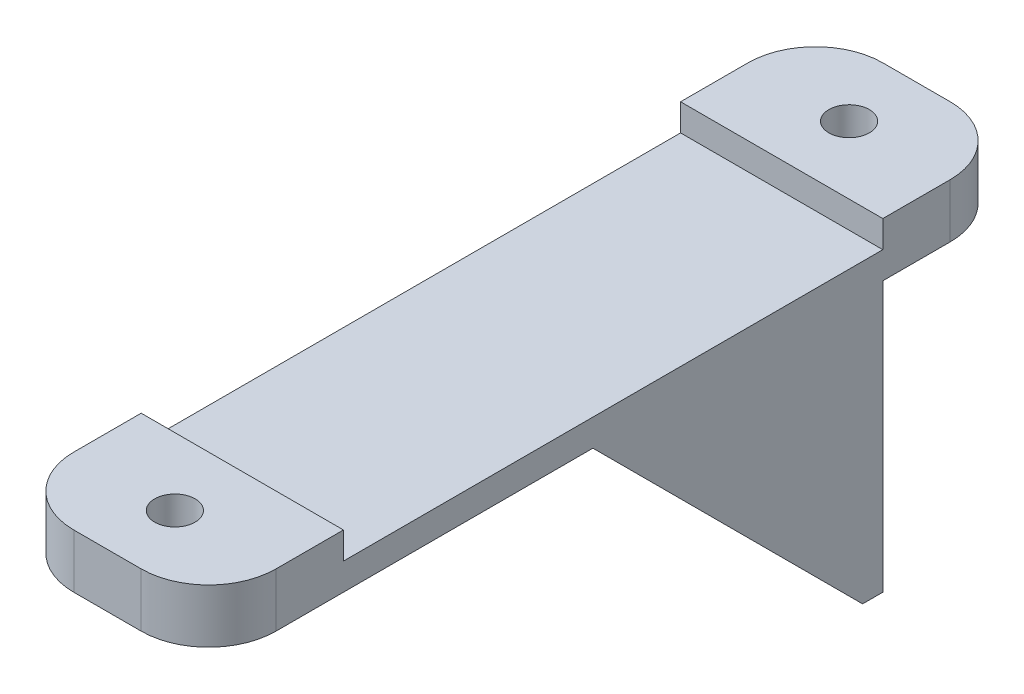
ISO-10303-21;
HEADER;
FILE_DESCRIPTION(('STEP AP214'),'2;1');
FILE_NAME('part.step','',(''),(''),'','','');
FILE_SCHEMA(('AUTOMOTIVE_DESIGN { 1 0 10303 214 1 1 1 1 }'));
ENDSEC;
DATA;
#1=APPLICATION_CONTEXT('core data for automotive mechanical design processes');
#2=APPLICATION_PROTOCOL_DEFINITION('international standard','automotive_design',2000,#1);
#3=PRODUCT_CONTEXT('',#1,'mechanical');
#4=PRODUCT('Part','Part','',(#3));
#5=PRODUCT_RELATED_PRODUCT_CATEGORY('part','',(#4));
#6=PRODUCT_DEFINITION_FORMATION('','',#4);
#7=PRODUCT_DEFINITION_CONTEXT('part definition',#1,'design');
#8=PRODUCT_DEFINITION('design','',#6,#7);
#9=PRODUCT_DEFINITION_SHAPE('','',#8);
#10=(LENGTH_UNIT() NAMED_UNIT(*) SI_UNIT(.MILLI.,.METRE.));
#11=(NAMED_UNIT(*) PLANE_ANGLE_UNIT() SI_UNIT($,.RADIAN.));
#12=(NAMED_UNIT(*) SI_UNIT($,.STERADIAN.) SOLID_ANGLE_UNIT());
#13=UNCERTAINTY_MEASURE_WITH_UNIT(LENGTH_MEASURE(1.E-05),#10,'distance_accuracy_value','');
#14=(GEOMETRIC_REPRESENTATION_CONTEXT(3) GLOBAL_UNCERTAINTY_ASSIGNED_CONTEXT((#13)) GLOBAL_UNIT_ASSIGNED_CONTEXT((#10,
#11,#12)) REPRESENTATION_CONTEXT('',''));
#15=CARTESIAN_POINT('',(0.,0.,0.));
#16=DIRECTION('',(0.,0.,1.));
#17=DIRECTION('',(1.,0.,0.));
#18=AXIS2_PLACEMENT_3D('',#15,#16,#17);
#19=CARTESIAN_POINT('',(0.,-40.,-97.));
#20=DIRECTION('',(0.,0.,-1.));
#21=DIRECTION('',(-1.,0.,0.));
#22=AXIS2_PLACEMENT_3D('',#19,#20,#21);
#23=PLANE('',#22);
#24=CARTESIAN_POINT('',(15.,-20.,-97.));
#25=DIRECTION('',(0.,0.,1.));
#26=DIRECTION('',(1.,0.,0.));
#27=AXIS2_PLACEMENT_3D('',#24,#25,#26);
#28=CIRCLE('',#27,8.6);
#29=CARTESIAN_POINT('',(23.6,-20.,-97.));
#30=VERTEX_POINT('',#29);
#31=EDGE_CURVE('E362',#30,#30,#28,.T.);
#32=ORIENTED_EDGE('',*,*,#31,.F.);
#33=EDGE_LOOP('',(#32));
#34=FACE_BOUND('',#33,.T.);
#35=DIRECTION('',(0.,-1.,0.));
#36=VECTOR('',#35,1.);
#37=CARTESIAN_POINT('',(2.5,-40.,-97.));
#38=LINE('',#37,#36);
#39=CARTESIAN_POINT('',(2.5,0.,-97.));
#40=VERTEX_POINT('',#39);
#41=CARTESIAN_POINT('',(2.5,-40.,-97.));
#42=VERTEX_POINT('',#41);
#43=EDGE_CURVE('E177',#40,#42,#38,.T.);
#44=ORIENTED_EDGE('',*,*,#43,.T.);
#45=DIRECTION('',(-1.,0.,0.));
#46=VECTOR('',#45,1.);
#47=CARTESIAN_POINT('',(0.,-40.,-97.));
#48=LINE('',#47,#46);
#49=CARTESIAN_POINT('',(27.5,-40.,-97.));
#50=VERTEX_POINT('',#49);
#51=EDGE_CURVE('E349',#50,#42,#48,.T.);
#52=ORIENTED_EDGE('',*,*,#51,.F.);
#53=DIRECTION('',(0.,1.,0.));
#54=VECTOR('',#53,1.);
#55=CARTESIAN_POINT('',(27.5,0.,-97.));
#56=LINE('',#55,#54);
#57=CARTESIAN_POINT('',(27.5,0.,-97.));
#58=VERTEX_POINT('',#57);
#59=EDGE_CURVE('E203',#50,#58,#56,.T.);
#60=ORIENTED_EDGE('',*,*,#59,.T.);
#61=DIRECTION('',(-1.,0.,0.));
#62=VECTOR('',#61,1.);
#63=CARTESIAN_POINT('',(0.,0.,-97.));
#64=LINE('',#63,#62);
#65=EDGE_CURVE('E195',#58,#40,#64,.T.);
#66=ORIENTED_EDGE('',*,*,#65,.T.);
#67=EDGE_LOOP('',(#44,#52,#60,#66));
#68=FACE_BOUND('',#67,.T.);
#69=ADVANCED_FACE('F45',(#34,#68),#23,.F.);
#70=CARTESIAN_POINT('',(0.,0.,0.));
#71=DIRECTION('',(0.,-1.,0.));
#72=DIRECTION('',(0.,0.,-1.));
#73=AXIS2_PLACEMENT_3D('',#70,#71,#72);
#74=PLANE('',#73);
#75=CARTESIAN_POINT('',(15.,0.,-10.));
#76=DIRECTION('',(0.,-1.,0.));
#77=DIRECTION('',(0.,0.,-1.));
#78=AXIS2_PLACEMENT_3D('',#75,#76,#77);
#79=CIRCLE('',#78,3.);
#80=CARTESIAN_POINT('',(15.,0.,-13.));
#81=VERTEX_POINT('',#80);
#82=EDGE_CURVE('E402',#81,#81,#79,.T.);
#83=ORIENTED_EDGE('',*,*,#82,.F.);
#84=EDGE_LOOP('',(#83));
#85=FACE_BOUND('',#84,.T.);
#86=DIRECTION('',(0.,0.,-1.));
#87=VECTOR('',#86,1.);
#88=CARTESIAN_POINT('',(30.,0.,0.));
#89=LINE('',#88,#87);
#90=CARTESIAN_POINT('',(30.,0.,-10.));
#91=VERTEX_POINT('',#90);
#92=CARTESIAN_POINT('',(30.,0.,-56.9999999999995));
#93=VERTEX_POINT('',#92);
#94=EDGE_CURVE('E288',#91,#93,#89,.T.);
#95=ORIENTED_EDGE('',*,*,#94,.F.);
#96=CARTESIAN_POINT('',(20.,0.,-10.));
#97=DIRECTION('',(0.,-1.,0.));
#98=DIRECTION('',(0.,0.,-1.));
#99=AXIS2_PLACEMENT_3D('',#96,#97,#98);
#100=CIRCLE('',#99,10.);
#101=CARTESIAN_POINT('',(20.,0.,0.));
#102=VERTEX_POINT('',#101);
#103=EDGE_CURVE('E330',#91,#102,#100,.T.);
#104=ORIENTED_EDGE('',*,*,#103,.T.);
#105=DIRECTION('',(1.,0.,0.));
#106=VECTOR('',#105,1.);
#107=CARTESIAN_POINT('',(0.,0.,0.));
#108=LINE('',#107,#106);
#109=CARTESIAN_POINT('',(10.,0.,0.));
#110=VERTEX_POINT('',#109);
#111=EDGE_CURVE('E284',#110,#102,#108,.T.);
#112=ORIENTED_EDGE('',*,*,#111,.F.);
#113=CARTESIAN_POINT('',(10.,0.,-10.));
#114=DIRECTION('',(0.,-1.,0.));
#115=DIRECTION('',(0.,0.,-1.));
#116=AXIS2_PLACEMENT_3D('',#113,#114,#115);
#117=CIRCLE('',#116,10.);
#118=CARTESIAN_POINT('',(0.,0.,-10.));
#119=VERTEX_POINT('',#118);
#120=EDGE_CURVE('E327',#110,#119,#117,.T.);
#121=ORIENTED_EDGE('',*,*,#120,.T.);
#122=DIRECTION('',(0.,0.,1.));
#123=VECTOR('',#122,1.);
#124=CARTESIAN_POINT('',(0.,0.,0.));
#125=LINE('',#124,#123);
#126=CARTESIAN_POINT('',(0.,0.,-56.9999999999995));
#127=VERTEX_POINT('',#126);
#128=EDGE_CURVE('E255',#127,#119,#125,.T.);
#129=ORIENTED_EDGE('',*,*,#128,.F.);
#130=DIRECTION('',(-1.,0.,0.));
#131=VECTOR('',#130,1.);
#132=CARTESIAN_POINT('',(2.5,0.,-56.9999999999995));
#133=LINE('',#132,#131);
#134=CARTESIAN_POINT('',(2.5,0.,-56.9999999999995));
#135=VERTEX_POINT('',#134);
#136=EDGE_CURVE('E197',#135,#127,#133,.T.);
#137=ORIENTED_EDGE('',*,*,#136,.F.);
#138=DIRECTION('',(0.,0.,-1.));
#139=VECTOR('',#138,1.);
#140=CARTESIAN_POINT('',(2.5,0.,-97.));
#141=LINE('',#140,#139);
#142=EDGE_CURVE('E180',#135,#40,#141,.T.);
#143=ORIENTED_EDGE('',*,*,#142,.T.);
#144=ORIENTED_EDGE('',*,*,#65,.F.);
#145=DIRECTION('',(0.,0.,1.));
#146=VECTOR('',#145,1.);
#147=CARTESIAN_POINT('',(27.5,0.,-56.9999999999995));
#148=LINE('',#147,#146);
#149=CARTESIAN_POINT('',(27.5,0.,-56.9999999999995));
#150=VERTEX_POINT('',#149);
#151=EDGE_CURVE('E377',#58,#150,#148,.T.);
#152=ORIENTED_EDGE('',*,*,#151,.T.);
#153=DIRECTION('',(1.,0.,0.));
#154=VECTOR('',#153,1.);
#155=CARTESIAN_POINT('',(27.5,0.,-56.9999999999995));
#156=LINE('',#155,#154);
#157=EDGE_CURVE('E366',#150,#93,#156,.T.);
#158=ORIENTED_EDGE('',*,*,#157,.T.);
#159=EDGE_LOOP('',(#95,#104,#112,#121,#129,#137,#143,#144,#152,#158));
#160=FACE_BOUND('',#159,.T.);
#161=ADVANCED_FACE('F193',(#85,#160),#74,.T.);
#162=CARTESIAN_POINT('',(0.,8.,0.));
#163=DIRECTION('',(0.,-1.,0.));
#164=DIRECTION('',(0.,0.,-1.));
#165=AXIS2_PLACEMENT_3D('',#162,#163,#164);
#166=PLANE('',#165);
#167=CARTESIAN_POINT('',(15.,8.,-110.));
#168=DIRECTION('',(0.,-1.,0.));
#169=DIRECTION('',(0.,0.,-1.));
#170=AXIS2_PLACEMENT_3D('',#167,#168,#169);
#171=CIRCLE('',#170,3.);
#172=CARTESIAN_POINT('',(15.,8.,-113.));
#173=VERTEX_POINT('',#172);
#174=EDGE_CURVE('E394',#173,#173,#171,.T.);
#175=ORIENTED_EDGE('',*,*,#174,.T.);
#176=EDGE_LOOP('',(#175));
#177=FACE_BOUND('',#176,.T.);
#178=DIRECTION('',(0.,0.,-1.));
#179=VECTOR('',#178,1.);
#180=CARTESIAN_POINT('',(30.,8.,0.));
#181=LINE('',#180,#179);
#182=CARTESIAN_POINT('',(30.,8.,-100.));
#183=VERTEX_POINT('',#182);
#184=CARTESIAN_POINT('',(30.,8.,-110.));
#185=VERTEX_POINT('',#184);
#186=EDGE_CURVE('E272',#183,#185,#181,.T.);
#187=ORIENTED_EDGE('',*,*,#186,.T.);
#188=CARTESIAN_POINT('',(20.,8.,-110.));
#189=DIRECTION('',(0.,-1.,0.));
#190=DIRECTION('',(0.,0.,-1.));
#191=AXIS2_PLACEMENT_3D('',#188,#189,#190);
#192=CIRCLE('',#191,10.);
#193=CARTESIAN_POINT('',(20.,8.,-120.));
#194=VERTEX_POINT('',#193);
#195=EDGE_CURVE('E317',#185,#194,#192,.F.);
#196=ORIENTED_EDGE('',*,*,#195,.T.);
#197=DIRECTION('',(-1.,0.,0.));
#198=VECTOR('',#197,1.);
#199=CARTESIAN_POINT('',(0.,8.,-120.));
#200=LINE('',#199,#198);
#201=CARTESIAN_POINT('',(10.,8.,-120.));
#202=VERTEX_POINT('',#201);
#203=EDGE_CURVE('E276',#194,#202,#200,.T.);
#204=ORIENTED_EDGE('',*,*,#203,.T.);
#205=CARTESIAN_POINT('',(10.,8.,-110.));
#206=DIRECTION('',(0.,-1.,0.));
#207=DIRECTION('',(0.,0.,-1.));
#208=AXIS2_PLACEMENT_3D('',#205,#206,#207);
#209=CIRCLE('',#208,10.);
#210=CARTESIAN_POINT('',(0.,8.,-110.));
#211=VERTEX_POINT('',#210);
#212=EDGE_CURVE('E314',#202,#211,#209,.F.);
#213=ORIENTED_EDGE('',*,*,#212,.T.);
#214=DIRECTION('',(0.,0.,1.));
#215=VECTOR('',#214,1.);
#216=CARTESIAN_POINT('',(0.,8.,0.));
#217=LINE('',#216,#215);
#218=CARTESIAN_POINT('',(0.,8.,-100.));
#219=VERTEX_POINT('',#218);
#220=EDGE_CURVE('E265',#211,#219,#217,.T.);
#221=ORIENTED_EDGE('',*,*,#220,.T.);
#222=DIRECTION('',(-1.,0.,0.));
#223=VECTOR('',#222,1.);
#224=CARTESIAN_POINT('',(30.,8.,-100.));
#225=LINE('',#224,#223);
#226=EDGE_CURVE('E233',#183,#219,#225,.T.);
#227=ORIENTED_EDGE('',*,*,#226,.F.);
#228=EDGE_LOOP('',(#187,#196,#204,#213,#221,#227));
#229=FACE_BOUND('',#228,.T.);
#230=ADVANCED_FACE('F421',(#177,#229),#166,.F.);
#231=CARTESIAN_POINT('',(0.,8.,0.));
#232=DIRECTION('',(1.,0.,0.));
#233=DIRECTION('',(0.,0.,-1.));
#234=AXIS2_PLACEMENT_3D('',#231,#232,#233);
#235=PLANE('',#234);
#236=ORIENTED_EDGE('',*,*,#220,.F.);
#237=DIRECTION('',(0.,-1.,0.));
#238=VECTOR('',#237,1.);
#239=CARTESIAN_POINT('',(0.,8.,-110.));
#240=LINE('',#239,#238);
#241=CARTESIAN_POINT('',(0.,0.,-110.));
#242=VERTEX_POINT('',#241);
#243=EDGE_CURVE('E323',#211,#242,#240,.T.);
#244=ORIENTED_EDGE('',*,*,#243,.T.);
#245=CARTESIAN_POINT('',(0.,0.,-100.));
#246=VERTEX_POINT('',#245);
#247=EDGE_CURVE('E281',#242,#246,#125,.T.);
#248=ORIENTED_EDGE('',*,*,#247,.T.);
#249=DIRECTION('',(0.,1.,0.));
#250=VECTOR('',#249,1.);
#251=CARTESIAN_POINT('',(0.,-40.,-100.));
#252=LINE('',#251,#250);
#253=CARTESIAN_POINT('',(0.,-40.,-100.));
#254=VERTEX_POINT('',#253);
#255=EDGE_CURVE('E222',#254,#246,#252,.T.);
#256=ORIENTED_EDGE('',*,*,#255,.F.);
#257=DIRECTION('',(0.,0.,-1.));
#258=VECTOR('',#257,1.);
#259=CARTESIAN_POINT('',(0.,-40.,-97.));
#260=LINE('',#259,#258);
#261=CARTESIAN_POINT('',(0.,-40.,-97.));
#262=VERTEX_POINT('',#261);
#263=EDGE_CURVE('E205',#262,#254,#260,.T.);
#264=ORIENTED_EDGE('',*,*,#263,.F.);
#265=DIRECTION('',(0.,0.707106781186544,0.707106781186551));
#266=VECTOR('',#265,1.);
#267=CARTESIAN_POINT('',(0.,0.,-56.9999999999995));
#268=LINE('',#267,#266);
#269=EDGE_CURVE('E199',#262,#127,#268,.T.);
#270=ORIENTED_EDGE('',*,*,#269,.T.);
#271=ORIENTED_EDGE('',*,*,#128,.T.);
#272=DIRECTION('',(0.,-1.,0.));
#273=VECTOR('',#272,1.);
#274=CARTESIAN_POINT('',(0.,8.,-10.));
#275=LINE('',#274,#273);
#276=CARTESIAN_POINT('',(0.,8.,-10.));
#277=VERTEX_POINT('',#276);
#278=EDGE_CURVE('E320',#119,#277,#275,.F.);
#279=ORIENTED_EDGE('',*,*,#278,.T.);
#280=CARTESIAN_POINT('',(0.,8.,-20.));
#281=VERTEX_POINT('',#280);
#282=EDGE_CURVE('E269',#281,#277,#217,.T.);
#283=ORIENTED_EDGE('',*,*,#282,.F.);
#284=DIRECTION('',(0.,1.,0.));
#285=VECTOR('',#284,1.);
#286=CARTESIAN_POINT('',(0.,4.,-20.));
#287=LINE('',#286,#285);
#288=CARTESIAN_POINT('',(0.,4.,-20.));
#289=VERTEX_POINT('',#288);
#290=EDGE_CURVE('E244',#289,#281,#287,.T.);
#291=ORIENTED_EDGE('',*,*,#290,.F.);
#292=DIRECTION('',(0.,0.,1.));
#293=VECTOR('',#292,1.);
#294=CARTESIAN_POINT('',(0.,4.,-100.));
#295=LINE('',#294,#293);
#296=CARTESIAN_POINT('',(0.,4.,-100.));
#297=VERTEX_POINT('',#296);
#298=EDGE_CURVE('E228',#297,#289,#295,.T.);
#299=ORIENTED_EDGE('',*,*,#298,.F.);
#300=DIRECTION('',(0.,1.,0.));
#301=VECTOR('',#300,1.);
#302=CARTESIAN_POINT('',(0.,4.,-100.));
#303=LINE('',#302,#301);
#304=EDGE_CURVE('E251',#297,#219,#303,.T.);
#305=ORIENTED_EDGE('',*,*,#304,.T.);
#306=EDGE_LOOP('',(#236,#244,#248,#256,#264,#270,#271,#279,#283,#291,#299,#305));
#307=FACE_BOUND('',#306,.T.);
#308=ADVANCED_FACE('F427',(#307),#235,.F.);
#309=CARTESIAN_POINT('',(0.,8.,0.));
#310=DIRECTION('',(0.,0.,-1.));
#311=DIRECTION('',(-1.,0.,0.));
#312=AXIS2_PLACEMENT_3D('',#309,#310,#311);
#313=PLANE('',#312);
#314=ORIENTED_EDGE('',*,*,#111,.T.);
#315=DIRECTION('',(0.,-1.,0.));
#316=VECTOR('',#315,1.);
#317=CARTESIAN_POINT('',(20.,8.,0.));
#318=LINE('',#317,#316);
#319=CARTESIAN_POINT('',(20.,8.,0.));
#320=VERTEX_POINT('',#319);
#321=EDGE_CURVE('E61',#102,#320,#318,.F.);
#322=ORIENTED_EDGE('',*,*,#321,.T.);
#323=DIRECTION('',(1.,0.,0.));
#324=VECTOR('',#323,1.);
#325=CARTESIAN_POINT('',(0.,8.,0.));
#326=LINE('',#325,#324);
#327=CARTESIAN_POINT('',(10.,8.,0.));
#328=VERTEX_POINT('',#327);
#329=EDGE_CURVE('E268',#328,#320,#326,.T.);
#330=ORIENTED_EDGE('',*,*,#329,.F.);
#331=DIRECTION('',(0.,-1.,0.));
#332=VECTOR('',#331,1.);
#333=CARTESIAN_POINT('',(10.,8.,0.));
#334=LINE('',#333,#332);
#335=EDGE_CURVE('E333',#328,#110,#334,.T.);
#336=ORIENTED_EDGE('',*,*,#335,.T.);
#337=EDGE_LOOP('',(#314,#322,#330,#336));
#338=FACE_BOUND('',#337,.T.);
#339=ADVANCED_FACE('F522',(#338),#313,.F.);
#340=CARTESIAN_POINT('',(30.,8.,0.));
#341=DIRECTION('',(-1.,0.,0.));
#342=DIRECTION('',(0.,0.,1.));
#343=AXIS2_PLACEMENT_3D('',#340,#341,#342);
#344=PLANE('',#343);
#345=CARTESIAN_POINT('',(30.,0.,-100.));
#346=VERTEX_POINT('',#345);
#347=CARTESIAN_POINT('',(30.,0.,-110.));
#348=VERTEX_POINT('',#347);
#349=EDGE_CURVE('E287',#346,#348,#89,.T.);
#350=ORIENTED_EDGE('',*,*,#349,.T.);
#351=DIRECTION('',(0.,-1.,0.));
#352=VECTOR('',#351,1.);
#353=CARTESIAN_POINT('',(30.,8.,-110.));
#354=LINE('',#353,#352);
#355=EDGE_CURVE('E311',#348,#185,#354,.F.);
#356=ORIENTED_EDGE('',*,*,#355,.T.);
#357=ORIENTED_EDGE('',*,*,#186,.F.);
#358=DIRECTION('',(0.,1.,0.));
#359=VECTOR('',#358,1.);
#360=CARTESIAN_POINT('',(30.,4.,-100.));
#361=LINE('',#360,#359);
#362=CARTESIAN_POINT('',(30.,4.,-100.));
#363=VERTEX_POINT('',#362);
#364=EDGE_CURVE('E256',#363,#183,#361,.T.);
#365=ORIENTED_EDGE('',*,*,#364,.F.);
#366=DIRECTION('',(0.,0.,-1.));
#367=VECTOR('',#366,1.);
#368=CARTESIAN_POINT('',(30.,4.,-100.));
#369=LINE('',#368,#367);
#370=CARTESIAN_POINT('',(30.,4.,-20.));
#371=VERTEX_POINT('',#370);
#372=EDGE_CURVE('E237',#371,#363,#369,.T.);
#373=ORIENTED_EDGE('',*,*,#372,.F.);
#374=DIRECTION('',(0.,1.,0.));
#375=VECTOR('',#374,1.);
#376=CARTESIAN_POINT('',(30.,4.,-20.));
#377=LINE('',#376,#375);
#378=CARTESIAN_POINT('',(30.,8.,-20.));
#379=VERTEX_POINT('',#378);
#380=EDGE_CURVE('E259',#371,#379,#377,.T.);
#381=ORIENTED_EDGE('',*,*,#380,.T.);
#382=CARTESIAN_POINT('',(30.,8.,-10.));
#383=VERTEX_POINT('',#382);
#384=EDGE_CURVE('E273',#383,#379,#181,.T.);
#385=ORIENTED_EDGE('',*,*,#384,.F.);
#386=DIRECTION('',(0.,-1.,0.));
#387=VECTOR('',#386,1.);
#388=CARTESIAN_POINT('',(30.,8.,-10.));
#389=LINE('',#388,#387);
#390=EDGE_CURVE('E307',#383,#91,#389,.T.);
#391=ORIENTED_EDGE('',*,*,#390,.T.);
#392=ORIENTED_EDGE('',*,*,#94,.T.);
#393=DIRECTION('',(0.,-0.707106781186544,-0.707106781186551));
#394=VECTOR('',#393,1.);
#395=CARTESIAN_POINT('',(30.,-40.,-97.));
#396=LINE('',#395,#394);
#397=CARTESIAN_POINT('',(30.,-40.,-97.));
#398=VERTEX_POINT('',#397);
#399=EDGE_CURVE('E371',#93,#398,#396,.T.);
#400=ORIENTED_EDGE('',*,*,#399,.T.);
#401=DIRECTION('',(0.,0.,1.));
#402=VECTOR('',#401,1.);
#403=CARTESIAN_POINT('',(30.,-40.,-97.));
#404=LINE('',#403,#402);
#405=CARTESIAN_POINT('',(30.,-40.,-100.));
#406=VERTEX_POINT('',#405);
#407=EDGE_CURVE('E351',#406,#398,#404,.T.);
#408=ORIENTED_EDGE('',*,*,#407,.F.);
#409=DIRECTION('',(0.,1.,0.));
#410=VECTOR('',#409,1.);
#411=CARTESIAN_POINT('',(30.,-40.,-100.));
#412=LINE('',#411,#410);
#413=EDGE_CURVE('E218',#406,#346,#412,.T.);
#414=ORIENTED_EDGE('',*,*,#413,.T.);
#415=EDGE_LOOP('',(#350,#356,#357,#365,#373,#381,#385,#391,#392,#400,#408,#414));
#416=FACE_BOUND('',#415,.T.);
#417=ADVANCED_FACE('F470',(#416),#344,.F.);
#418=CARTESIAN_POINT('',(0.,8.,-120.));
#419=DIRECTION('',(0.,0.,1.));
#420=DIRECTION('',(1.,0.,0.));
#421=AXIS2_PLACEMENT_3D('',#418,#419,#420);
#422=PLANE('',#421);
#423=ORIENTED_EDGE('',*,*,#203,.F.);
#424=DIRECTION('',(0.,-1.,0.));
#425=VECTOR('',#424,1.);
#426=CARTESIAN_POINT('',(20.,8.,-120.));
#427=LINE('',#426,#425);
#428=CARTESIAN_POINT('',(20.,0.,-120.));
#429=VERTEX_POINT('',#428);
#430=EDGE_CURVE('E297',#194,#429,#427,.T.);
#431=ORIENTED_EDGE('',*,*,#430,.T.);
#432=DIRECTION('',(-1.,0.,0.));
#433=VECTOR('',#432,1.);
#434=CARTESIAN_POINT('',(0.,0.,-120.));
#435=LINE('',#434,#433);
#436=CARTESIAN_POINT('',(10.,0.,-120.));
#437=VERTEX_POINT('',#436);
#438=EDGE_CURVE('E291',#429,#437,#435,.T.);
#439=ORIENTED_EDGE('',*,*,#438,.T.);
#440=DIRECTION('',(0.,-1.,0.));
#441=VECTOR('',#440,1.);
#442=CARTESIAN_POINT('',(10.,8.,-120.));
#443=LINE('',#442,#441);
#444=EDGE_CURVE('E280',#437,#202,#443,.F.);
#445=ORIENTED_EDGE('',*,*,#444,.T.);
#446=EDGE_LOOP('',(#423,#431,#439,#445));
#447=FACE_BOUND('',#446,.T.);
#448=ADVANCED_FACE('F445',(#447),#422,.F.);
#449=CARTESIAN_POINT('',(15.,8.,-10.));
#450=DIRECTION('',(0.,-1.,0.));
#451=DIRECTION('',(0.,0.,-1.));
#452=AXIS2_PLACEMENT_3D('',#449,#450,#451);
#453=CIRCLE('',#452,3.);
#454=CARTESIAN_POINT('',(15.,8.,-13.));
#455=VERTEX_POINT('',#454);
#456=EDGE_CURVE('E391',#455,#455,#453,.T.);
#457=ORIENTED_EDGE('',*,*,#456,.T.);
#458=EDGE_LOOP('',(#457));
#459=FACE_BOUND('',#458,.T.);
#460=ORIENTED_EDGE('',*,*,#329,.T.);
#461=CARTESIAN_POINT('',(20.,8.,-10.));
#462=DIRECTION('',(0.,-1.,0.));
#463=DIRECTION('',(0.,0.,-1.));
#464=AXIS2_PLACEMENT_3D('',#461,#462,#463);
#465=CIRCLE('',#464,10.);
#466=EDGE_CURVE('E11',#320,#383,#465,.F.);
#467=ORIENTED_EDGE('',*,*,#466,.T.);
#468=ORIENTED_EDGE('',*,*,#384,.T.);
#469=DIRECTION('',(1.,0.,0.));
#470=VECTOR('',#469,1.);
#471=CARTESIAN_POINT('',(30.,8.,-20.));
#472=LINE('',#471,#470);
#473=EDGE_CURVE('E227',#281,#379,#472,.T.);
#474=ORIENTED_EDGE('',*,*,#473,.F.);
#475=ORIENTED_EDGE('',*,*,#282,.T.);
#476=CARTESIAN_POINT('',(10.,8.,-10.));
#477=DIRECTION('',(0.,-1.,0.));
#478=DIRECTION('',(0.,0.,-1.));
#479=AXIS2_PLACEMENT_3D('',#476,#477,#478);
#480=CIRCLE('',#479,10.);
#481=EDGE_CURVE('E54',#277,#328,#480,.F.);
#482=ORIENTED_EDGE('',*,*,#481,.T.);
#483=EDGE_LOOP('',(#460,#467,#468,#474,#475,#482));
#484=FACE_BOUND('',#483,.T.);
#485=ADVANCED_FACE('F410',(#459,#484),#166,.F.);
#486=CARTESIAN_POINT('',(15.,0.,-110.));
#487=DIRECTION('',(0.,-1.,0.));
#488=DIRECTION('',(0.,0.,-1.));
#489=AXIS2_PLACEMENT_3D('',#486,#487,#488);
#490=CIRCLE('',#489,3.);
#491=CARTESIAN_POINT('',(15.,0.,-113.));
#492=VERTEX_POINT('',#491);
#493=EDGE_CURVE('E398',#492,#492,#490,.T.);
#494=ORIENTED_EDGE('',*,*,#493,.F.);
#495=EDGE_LOOP('',(#494));
#496=FACE_BOUND('',#495,.T.);
#497=ORIENTED_EDGE('',*,*,#438,.F.);
#498=CARTESIAN_POINT('',(20.,0.,-110.));
#499=DIRECTION('',(0.,-1.,0.));
#500=DIRECTION('',(0.,0.,-1.));
#501=AXIS2_PLACEMENT_3D('',#498,#499,#500);
#502=CIRCLE('',#501,10.);
#503=EDGE_CURVE('E304',#429,#348,#502,.T.);
#504=ORIENTED_EDGE('',*,*,#503,.T.);
#505=ORIENTED_EDGE('',*,*,#349,.F.);
#506=DIRECTION('',(1.,0.,0.));
#507=VECTOR('',#506,1.);
#508=CARTESIAN_POINT('',(0.,0.,-100.));
#509=LINE('',#508,#507);
#510=EDGE_CURVE('E206',#246,#346,#509,.T.);
#511=ORIENTED_EDGE('',*,*,#510,.F.);
#512=ORIENTED_EDGE('',*,*,#247,.F.);
#513=CARTESIAN_POINT('',(10.,0.,-110.));
#514=DIRECTION('',(0.,-1.,0.));
#515=DIRECTION('',(0.,0.,-1.));
#516=AXIS2_PLACEMENT_3D('',#513,#514,#515);
#517=CIRCLE('',#516,10.);
#518=EDGE_CURVE('E301',#242,#437,#517,.T.);
#519=ORIENTED_EDGE('',*,*,#518,.T.);
#520=EDGE_LOOP('',(#497,#504,#505,#511,#512,#519));
#521=FACE_BOUND('',#520,.T.);
#522=ADVANCED_FACE('F423',(#496,#521),#74,.T.);
#523=CARTESIAN_POINT('',(30.,4.,-100.));
#524=DIRECTION('',(0.,0.,-1.));
#525=DIRECTION('',(-1.,0.,0.));
#526=AXIS2_PLACEMENT_3D('',#523,#524,#525);
#527=PLANE('',#526);
#528=ORIENTED_EDGE('',*,*,#226,.T.);
#529=ORIENTED_EDGE('',*,*,#304,.F.);
#530=DIRECTION('',(-1.,0.,0.));
#531=VECTOR('',#530,1.);
#532=CARTESIAN_POINT('',(30.,4.,-100.));
#533=LINE('',#532,#531);
#534=EDGE_CURVE('E240',#363,#297,#533,.T.);
#535=ORIENTED_EDGE('',*,*,#534,.F.);
#536=ORIENTED_EDGE('',*,*,#364,.T.);
#537=EDGE_LOOP('',(#528,#529,#535,#536));
#538=FACE_BOUND('',#537,.T.);
#539=ADVANCED_FACE('F435',(#538),#527,.F.);
#540=CARTESIAN_POINT('',(30.,4.,-20.));
#541=DIRECTION('',(0.,0.,1.));
#542=DIRECTION('',(1.,0.,0.));
#543=AXIS2_PLACEMENT_3D('',#540,#541,#542);
#544=PLANE('',#543);
#545=ORIENTED_EDGE('',*,*,#473,.T.);
#546=ORIENTED_EDGE('',*,*,#380,.F.);
#547=DIRECTION('',(1.,0.,0.));
#548=VECTOR('',#547,1.);
#549=CARTESIAN_POINT('',(30.,4.,-20.));
#550=LINE('',#549,#548);
#551=EDGE_CURVE('E232',#289,#371,#550,.T.);
#552=ORIENTED_EDGE('',*,*,#551,.F.);
#553=ORIENTED_EDGE('',*,*,#290,.T.);
#554=EDGE_LOOP('',(#545,#546,#552,#553));
#555=FACE_BOUND('',#554,.T.);
#556=ADVANCED_FACE('F442',(#555),#544,.F.);
#557=CARTESIAN_POINT('',(0.,4.,0.));
#558=DIRECTION('',(0.,-1.,0.));
#559=DIRECTION('',(0.,0.,-1.));
#560=AXIS2_PLACEMENT_3D('',#557,#558,#559);
#561=PLANE('',#560);
#562=ORIENTED_EDGE('',*,*,#298,.T.);
#563=ORIENTED_EDGE('',*,*,#551,.T.);
#564=ORIENTED_EDGE('',*,*,#372,.T.);
#565=ORIENTED_EDGE('',*,*,#534,.T.);
#566=EDGE_LOOP('',(#562,#563,#564,#565));
#567=FACE_BOUND('',#566,.T.);
#568=ADVANCED_FACE('F467',(#567),#561,.F.);
#569=CARTESIAN_POINT('',(0.,-40.,-100.));
#570=DIRECTION('',(0.,0.,1.));
#571=DIRECTION('',(1.,0.,0.));
#572=AXIS2_PLACEMENT_3D('',#569,#570,#571);
#573=PLANE('',#572);
#574=CARTESIAN_POINT('',(15.,-20.,-100.));
#575=DIRECTION('',(0.,0.,1.));
#576=DIRECTION('',(1.,0.,0.));
#577=AXIS2_PLACEMENT_3D('',#574,#575,#576);
#578=CIRCLE('',#577,8.6);
#579=CARTESIAN_POINT('',(23.6,-20.,-100.));
#580=VERTEX_POINT('',#579);
#581=EDGE_CURVE('E214',#580,#580,#578,.T.);
#582=ORIENTED_EDGE('',*,*,#581,.T.);
#583=EDGE_LOOP('',(#582));
#584=FACE_BOUND('',#583,.T.);
#585=ORIENTED_EDGE('',*,*,#510,.T.);
#586=ORIENTED_EDGE('',*,*,#413,.F.);
#587=DIRECTION('',(1.,0.,0.));
#588=VECTOR('',#587,1.);
#589=CARTESIAN_POINT('',(0.,-40.,-100.));
#590=LINE('',#589,#588);
#591=EDGE_CURVE('E211',#254,#406,#590,.T.);
#592=ORIENTED_EDGE('',*,*,#591,.F.);
#593=ORIENTED_EDGE('',*,*,#255,.T.);
#594=EDGE_LOOP('',(#585,#586,#592,#593));
#595=FACE_BOUND('',#594,.T.);
#596=ADVANCED_FACE('F479',(#584,#595),#573,.F.);
#597=CARTESIAN_POINT('',(0.,-40.,0.));
#598=DIRECTION('',(0.,-1.,0.));
#599=DIRECTION('',(0.,0.,-1.));
#600=AXIS2_PLACEMENT_3D('',#597,#598,#599);
#601=PLANE('',#600);
#602=ORIENTED_EDGE('',*,*,#263,.T.);
#603=ORIENTED_EDGE('',*,*,#591,.T.);
#604=ORIENTED_EDGE('',*,*,#407,.T.);
#605=EDGE_CURVE('E223',#398,#50,#48,.T.);
#606=ORIENTED_EDGE('',*,*,#605,.T.);
#607=ORIENTED_EDGE('',*,*,#51,.T.);
#608=DIRECTION('',(-1.,0.,0.));
#609=VECTOR('',#608,1.);
#610=CARTESIAN_POINT('',(2.5,-40.,-97.));
#611=LINE('',#610,#609);
#612=EDGE_CURVE('E382',#42,#262,#611,.T.);
#613=ORIENTED_EDGE('',*,*,#612,.T.);
#614=EDGE_LOOP('',(#602,#603,#604,#606,#607,#613));
#615=FACE_BOUND('',#614,.T.);
#616=ADVANCED_FACE('F482',(#615),#601,.T.);
#617=CARTESIAN_POINT('',(15.,-20.,-137.));
#618=DIRECTION('',(0.,0.,1.));
#619=DIRECTION('',(1.,0.,0.));
#620=AXIS2_PLACEMENT_3D('',#617,#618,#619);
#621=CYLINDRICAL_SURFACE('',#620,8.6);
#622=ORIENTED_EDGE('',*,*,#31,.T.);
#623=EDGE_LOOP('',(#622));
#624=FACE_BOUND('',#623,.T.);
#625=ORIENTED_EDGE('',*,*,#581,.F.);
#626=EDGE_LOOP('',(#625));
#627=FACE_BOUND('',#626,.T.);
#628=ADVANCED_FACE('F501',(#624,#627),#621,.F.);
#629=CARTESIAN_POINT('',(27.5,-40.,-97.));
#630=DIRECTION('',(0.,-0.707106781186551,0.707106781186544));
#631=DIRECTION('',(0.,-0.707106781186544,-0.707106781186551));
#632=AXIS2_PLACEMENT_3D('',#629,#630,#631);
#633=PLANE('',#632);
#634=ORIENTED_EDGE('',*,*,#399,.F.);
#635=ORIENTED_EDGE('',*,*,#157,.F.);
#636=DIRECTION('',(0.,-0.707106781186544,-0.707106781186551));
#637=VECTOR('',#636,1.);
#638=CARTESIAN_POINT('',(27.5,-40.,-97.));
#639=LINE('',#638,#637);
#640=EDGE_CURVE('E370',#150,#50,#639,.T.);
#641=ORIENTED_EDGE('',*,*,#640,.T.);
#642=ORIENTED_EDGE('',*,*,#605,.F.);
#643=EDGE_LOOP('',(#634,#635,#641,#642));
#644=FACE_BOUND('',#643,.T.);
#645=ADVANCED_FACE('F494',(#644),#633,.T.);
#646=CARTESIAN_POINT('',(27.5,0.,0.));
#647=DIRECTION('',(1.,0.,0.));
#648=DIRECTION('',(0.,0.,-1.));
#649=AXIS2_PLACEMENT_3D('',#646,#647,#648);
#650=PLANE('',#649);
#651=ORIENTED_EDGE('',*,*,#59,.F.);
#652=ORIENTED_EDGE('',*,*,#640,.F.);
#653=ORIENTED_EDGE('',*,*,#151,.F.);
#654=EDGE_LOOP('',(#651,#652,#653));
#655=FACE_BOUND('',#654,.T.);
#656=ADVANCED_FACE('F486',(#655),#650,.F.);
#657=CARTESIAN_POINT('',(2.5,0.,-56.9999999999995));
#658=DIRECTION('',(0.,-0.707106781186551,0.707106781186544));
#659=DIRECTION('',(0.,-0.707106781186544,-0.707106781186551));
#660=AXIS2_PLACEMENT_3D('',#657,#658,#659);
#661=PLANE('',#660);
#662=ORIENTED_EDGE('',*,*,#269,.F.);
#663=ORIENTED_EDGE('',*,*,#612,.F.);
#664=DIRECTION('',(0.,0.707106781186544,0.707106781186551));
#665=VECTOR('',#664,1.);
#666=CARTESIAN_POINT('',(2.5,0.,-56.9999999999995));
#667=LINE('',#666,#665);
#668=EDGE_CURVE('E182',#42,#135,#667,.T.);
#669=ORIENTED_EDGE('',*,*,#668,.T.);
#670=ORIENTED_EDGE('',*,*,#136,.T.);
#671=EDGE_LOOP('',(#662,#663,#669,#670));
#672=FACE_BOUND('',#671,.T.);
#673=ADVANCED_FACE('F484',(#672),#661,.T.);
#674=CARTESIAN_POINT('',(2.5,0.,0.));
#675=DIRECTION('',(-1.,0.,0.));
#676=DIRECTION('',(0.,0.,1.));
#677=AXIS2_PLACEMENT_3D('',#674,#675,#676);
#678=PLANE('',#677);
#679=ORIENTED_EDGE('',*,*,#142,.F.);
#680=ORIENTED_EDGE('',*,*,#668,.F.);
#681=ORIENTED_EDGE('',*,*,#43,.F.);
#682=EDGE_LOOP('',(#679,#680,#681));
#683=FACE_BOUND('',#682,.T.);
#684=ADVANCED_FACE('F179',(#683),#678,.F.);
#685=CARTESIAN_POINT('',(15.,8.,-110.));
#686=DIRECTION('',(0.,-1.,0.));
#687=DIRECTION('',(0.,0.,-1.));
#688=AXIS2_PLACEMENT_3D('',#685,#686,#687);
#689=CYLINDRICAL_SURFACE('',#688,3.);
#690=ORIENTED_EDGE('',*,*,#174,.F.);
#691=EDGE_LOOP('',(#690));
#692=FACE_BOUND('',#691,.T.);
#693=ORIENTED_EDGE('',*,*,#493,.T.);
#694=EDGE_LOOP('',(#693));
#695=FACE_BOUND('',#694,.T.);
#696=ADVANCED_FACE('F416',(#692,#695),#689,.F.);
#697=CARTESIAN_POINT('',(15.,8.,-10.));
#698=DIRECTION('',(0.,-1.,0.));
#699=DIRECTION('',(0.,0.,-1.));
#700=AXIS2_PLACEMENT_3D('',#697,#698,#699);
#701=CYLINDRICAL_SURFACE('',#700,3.);
#702=ORIENTED_EDGE('',*,*,#456,.F.);
#703=EDGE_LOOP('',(#702));
#704=FACE_BOUND('',#703,.T.);
#705=ORIENTED_EDGE('',*,*,#82,.T.);
#706=EDGE_LOOP('',(#705));
#707=FACE_BOUND('',#706,.T.);
#708=ADVANCED_FACE('F412',(#704,#707),#701,.F.);
#709=CARTESIAN_POINT('',(20.,8.,-110.));
#710=DIRECTION('',(0.,-1.,0.));
#711=DIRECTION('',(0.,0.,-1.));
#712=AXIS2_PLACEMENT_3D('',#709,#710,#711);
#713=CYLINDRICAL_SURFACE('',#712,10.);
#714=ORIENTED_EDGE('',*,*,#195,.F.);
#715=ORIENTED_EDGE('',*,*,#355,.F.);
#716=ORIENTED_EDGE('',*,*,#503,.F.);
#717=ORIENTED_EDGE('',*,*,#430,.F.);
#718=EDGE_LOOP('',(#714,#715,#716,#717));
#719=FACE_BOUND('',#718,.T.);
#720=ADVANCED_FACE('F415',(#719),#713,.T.);
#721=CARTESIAN_POINT('',(10.,8.,-110.));
#722=DIRECTION('',(0.,-1.,0.));
#723=DIRECTION('',(0.,0.,-1.));
#724=AXIS2_PLACEMENT_3D('',#721,#722,#723);
#725=CYLINDRICAL_SURFACE('',#724,10.);
#726=ORIENTED_EDGE('',*,*,#212,.F.);
#727=ORIENTED_EDGE('',*,*,#444,.F.);
#728=ORIENTED_EDGE('',*,*,#518,.F.);
#729=ORIENTED_EDGE('',*,*,#243,.F.);
#730=EDGE_LOOP('',(#726,#727,#728,#729));
#731=FACE_BOUND('',#730,.T.);
#732=ADVANCED_FACE('F456',(#731),#725,.T.);
#733=CARTESIAN_POINT('',(20.,8.,-10.));
#734=DIRECTION('',(0.,-1.,0.));
#735=DIRECTION('',(0.,0.,-1.));
#736=AXIS2_PLACEMENT_3D('',#733,#734,#735);
#737=CYLINDRICAL_SURFACE('',#736,10.);
#738=ORIENTED_EDGE('',*,*,#466,.F.);
#739=ORIENTED_EDGE('',*,*,#321,.F.);
#740=ORIENTED_EDGE('',*,*,#103,.F.);
#741=ORIENTED_EDGE('',*,*,#390,.F.);
#742=EDGE_LOOP('',(#738,#739,#740,#741));
#743=FACE_BOUND('',#742,.T.);
#744=ADVANCED_FACE('F526',(#743),#737,.T.);
#745=CARTESIAN_POINT('',(10.,8.,-10.));
#746=DIRECTION('',(0.,-1.,0.));
#747=DIRECTION('',(0.,0.,-1.));
#748=AXIS2_PLACEMENT_3D('',#745,#746,#747);
#749=CYLINDRICAL_SURFACE('',#748,10.);
#750=ORIENTED_EDGE('',*,*,#481,.F.);
#751=ORIENTED_EDGE('',*,*,#278,.F.);
#752=ORIENTED_EDGE('',*,*,#120,.F.);
#753=ORIENTED_EDGE('',*,*,#335,.F.);
#754=EDGE_LOOP('',(#750,#751,#752,#753));
#755=FACE_BOUND('',#754,.T.);
#756=ADVANCED_FACE('F47',(#755),#749,.T.);
#757=CLOSED_SHELL('',(#69,#161,#230,#308,#339,#417,#448,#485,#522,#539,#556,#568,#596,#616,#628,
#645,#656,#673,#684,#696,#708,#720,#732,#744,#756));
#758=MANIFOLD_SOLID_BREP('B2',#757);
#759=ADVANCED_BREP_SHAPE_REPRESENTATION('',(#18,#758),#14);
#760=SHAPE_DEFINITION_REPRESENTATION(#9,#759);
ENDSEC;
END-ISO-10303-21;
